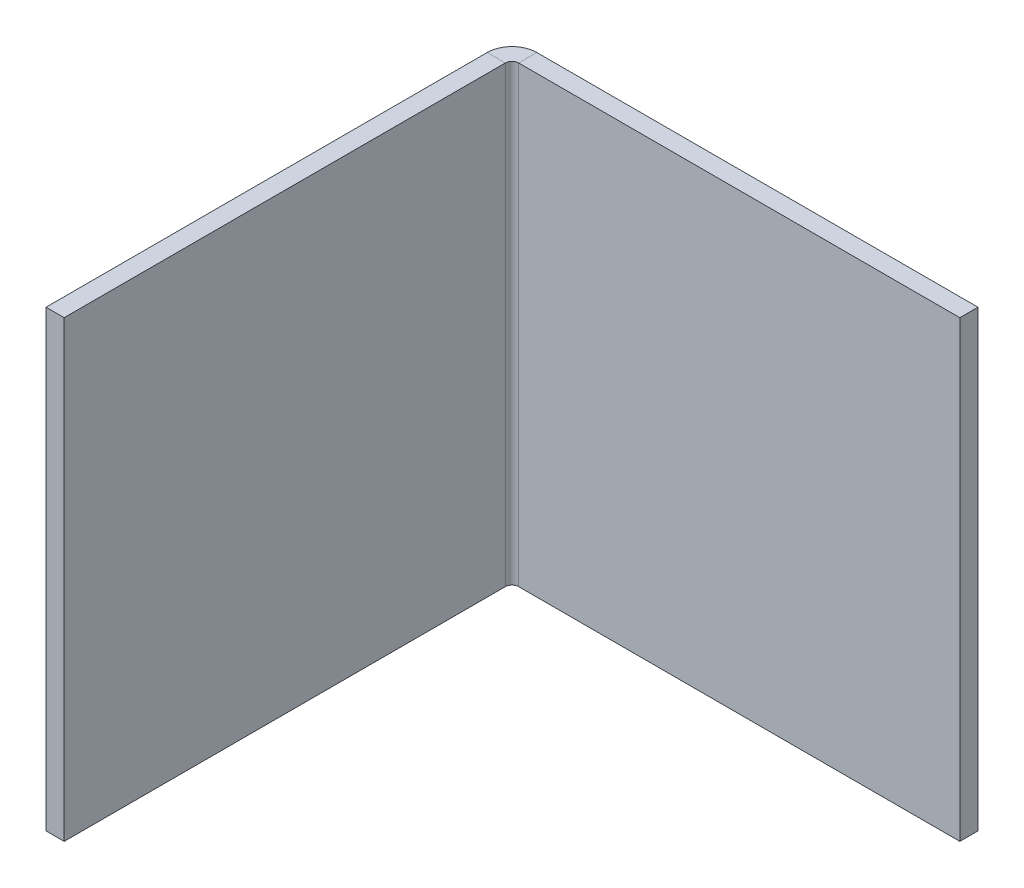
ISO-10303-21;
HEADER;
FILE_DESCRIPTION(('STEP AP214'),'2;1');
FILE_NAME('part.step','',(''),(''),'','','');
FILE_SCHEMA(('AUTOMOTIVE_DESIGN { 1 0 10303 214 1 1 1 1 }'));
ENDSEC;
DATA;
#1=APPLICATION_CONTEXT('core data for automotive mechanical design processes');
#2=APPLICATION_PROTOCOL_DEFINITION('international standard','automotive_design',2000,#1);
#3=PRODUCT_CONTEXT('',#1,'mechanical');
#4=PRODUCT('Part','Part','',(#3));
#5=PRODUCT_RELATED_PRODUCT_CATEGORY('part','',(#4));
#6=PRODUCT_DEFINITION_FORMATION('','',#4);
#7=PRODUCT_DEFINITION_CONTEXT('part definition',#1,'design');
#8=PRODUCT_DEFINITION('design','',#6,#7);
#9=PRODUCT_DEFINITION_SHAPE('','',#8);
#10=(LENGTH_UNIT() NAMED_UNIT(*) SI_UNIT(.MILLI.,.METRE.));
#11=(NAMED_UNIT(*) PLANE_ANGLE_UNIT() SI_UNIT($,.RADIAN.));
#12=(NAMED_UNIT(*) SI_UNIT($,.STERADIAN.) SOLID_ANGLE_UNIT());
#13=UNCERTAINTY_MEASURE_WITH_UNIT(LENGTH_MEASURE(1.E-05),#10,'distance_accuracy_value','');
#14=(GEOMETRIC_REPRESENTATION_CONTEXT(3) GLOBAL_UNCERTAINTY_ASSIGNED_CONTEXT((#13)) GLOBAL_UNIT_ASSIGNED_CONTEXT((#10,
#11,#12)) REPRESENTATION_CONTEXT('',''));
#15=CARTESIAN_POINT('',(0.,0.,0.));
#16=DIRECTION('',(0.,0.,1.));
#17=DIRECTION('',(1.,0.,0.));
#18=AXIS2_PLACEMENT_3D('',#15,#16,#17);
#19=CARTESIAN_POINT('',(-1.37267754944382,-25.,49.372677549444));
#20=DIRECTION('',(0.,-1.,0.));
#21=DIRECTION('',(-1.,0.,0.));
#22=AXIS2_PLACEMENT_3D('',#19,#20,#21);
#23=PLANE('',#22);
#24=DIRECTION('',(0.,0.,-1.));
#25=VECTOR('',#24,1.);
#26=CARTESIAN_POINT('',(-1.37267754944382,-25.,49.372677549444));
#27=LINE('',#26,#25);
#28=CARTESIAN_POINT('',(-1.37267754944382,-25.,49.372677549444));
#29=VERTEX_POINT('',#28);
#30=CARTESIAN_POINT('',(-1.37267754944399,-25.,0.736600000000009));
#31=VERTEX_POINT('',#30);
#32=EDGE_CURVE('E104',#29,#31,#27,.T.);
#33=ORIENTED_EDGE('',*,*,#32,.T.);
#34=DIRECTION('',(1.,0.,0.));
#35=VECTOR('',#34,1.);
#36=CARTESIAN_POINT('',(-1.37267754944399,-25.,0.736600000000009));
#37=LINE('',#36,#35);
#38=CARTESIAN_POINT('',(0.627322450556012,-25.,0.736600000000003));
#39=VERTEX_POINT('',#38);
#40=EDGE_CURVE('E12',#31,#39,#37,.T.);
#41=ORIENTED_EDGE('',*,*,#40,.T.);
#42=DIRECTION('',(0.,0.,-1.));
#43=VECTOR('',#42,1.);
#44=CARTESIAN_POINT('',(0.627322450556181,-25.,49.372677549444));
#45=LINE('',#44,#43);
#46=CARTESIAN_POINT('',(0.627322450556181,-25.,49.372677549444));
#47=VERTEX_POINT('',#46);
#48=EDGE_CURVE('E97',#47,#39,#45,.T.);
#49=ORIENTED_EDGE('',*,*,#48,.F.);
#50=DIRECTION('',(1.,0.,0.));
#51=VECTOR('',#50,1.);
#52=CARTESIAN_POINT('',(-1.37267754944382,-25.,49.372677549444));
#53=LINE('',#52,#51);
#54=EDGE_CURVE('E70',#29,#47,#53,.T.);
#55=ORIENTED_EDGE('',*,*,#54,.F.);
#56=EDGE_LOOP('',(#33,#41,#49,#55));
#57=FACE_BOUND('',#56,.T.);
#58=ADVANCED_FACE('F45',(#57),#23,.T.);
#59=CARTESIAN_POINT('',(-1.37267754944382,25.,49.372677549444));
#60=DIRECTION('',(0.,1.,0.));
#61=DIRECTION('',(1.,0.,0.));
#62=AXIS2_PLACEMENT_3D('',#59,#60,#61);
#63=PLANE('',#62);
#64=DIRECTION('',(0.,0.,1.));
#65=VECTOR('',#64,1.);
#66=CARTESIAN_POINT('',(0.627322450556181,25.,49.372677549444));
#67=LINE('',#66,#65);
#68=CARTESIAN_POINT('',(0.627322450556012,25.,0.736600000000003));
#69=VERTEX_POINT('',#68);
#70=CARTESIAN_POINT('',(0.627322450556181,25.,49.372677549444));
#71=VERTEX_POINT('',#70);
#72=EDGE_CURVE('E99',#69,#71,#67,.T.);
#73=ORIENTED_EDGE('',*,*,#72,.F.);
#74=DIRECTION('',(-1.,0.,0.));
#75=VECTOR('',#74,1.);
#76=CARTESIAN_POINT('',(-1.37267754944399,25.,0.736600000000009));
#77=LINE('',#76,#75);
#78=CARTESIAN_POINT('',(-1.37267754944399,25.,0.736600000000013));
#79=VERTEX_POINT('',#78);
#80=EDGE_CURVE('E153',#69,#79,#77,.T.);
#81=ORIENTED_EDGE('',*,*,#80,.T.);
#82=DIRECTION('',(0.,0.,1.));
#83=VECTOR('',#82,1.);
#84=CARTESIAN_POINT('',(-1.37267754944382,25.,49.372677549444));
#85=LINE('',#84,#83);
#86=CARTESIAN_POINT('',(-1.37267754944382,25.,49.372677549444));
#87=VERTEX_POINT('',#86);
#88=EDGE_CURVE('E48',#79,#87,#85,.T.);
#89=ORIENTED_EDGE('',*,*,#88,.T.);
#90=DIRECTION('',(1.,0.,0.));
#91=VECTOR('',#90,1.);
#92=CARTESIAN_POINT('',(-1.37267754944382,25.,49.372677549444));
#93=LINE('',#92,#91);
#94=EDGE_CURVE('E90',#87,#71,#93,.T.);
#95=ORIENTED_EDGE('',*,*,#94,.T.);
#96=EDGE_LOOP('',(#73,#81,#89,#95));
#97=FACE_BOUND('',#96,.T.);
#98=ADVANCED_FACE('F215',(#97),#63,.T.);
#99=CARTESIAN_POINT('',(-1.37267754944399,0.,-0.627322450556004));
#100=DIRECTION('',(-1.,0.,0.));
#101=DIRECTION('',(0.,0.,1.));
#102=AXIS2_PLACEMENT_3D('',#99,#100,#101);
#103=PLANE('',#102);
#104=ORIENTED_EDGE('',*,*,#88,.F.);
#105=DIRECTION('',(0.,-1.,0.));
#106=VECTOR('',#105,1.);
#107=CARTESIAN_POINT('',(-1.37267754944399,0.,0.736600000000008));
#108=LINE('',#107,#106);
#109=EDGE_CURVE('E89',#79,#31,#108,.T.);
#110=ORIENTED_EDGE('',*,*,#109,.T.);
#111=ORIENTED_EDGE('',*,*,#32,.F.);
#112=DIRECTION('',(0.,-1.,0.));
#113=VECTOR('',#112,1.);
#114=CARTESIAN_POINT('',(-1.37267754944382,-25.,49.372677549444));
#115=LINE('',#114,#113);
#116=EDGE_CURVE('E87',#87,#29,#115,.T.);
#117=ORIENTED_EDGE('',*,*,#116,.F.);
#118=EDGE_LOOP('',(#104,#110,#111,#117));
#119=FACE_BOUND('',#118,.T.);
#120=ADVANCED_FACE('F213',(#119),#103,.T.);
#121=CARTESIAN_POINT('',(-1.37267754944382,-25.,49.372677549444));
#122=DIRECTION('',(0.,0.,1.));
#123=DIRECTION('',(1.,0.,0.));
#124=AXIS2_PLACEMENT_3D('',#121,#122,#123);
#125=PLANE('',#124);
#126=DIRECTION('',(0.,-1.,0.));
#127=VECTOR('',#126,1.);
#128=CARTESIAN_POINT('',(0.627322450556181,-25.,49.372677549444));
#129=LINE('',#128,#127);
#130=EDGE_CURVE('E85',#71,#47,#129,.T.);
#131=ORIENTED_EDGE('',*,*,#130,.F.);
#132=ORIENTED_EDGE('',*,*,#94,.F.);
#133=ORIENTED_EDGE('',*,*,#116,.T.);
#134=ORIENTED_EDGE('',*,*,#54,.T.);
#135=EDGE_LOOP('',(#131,#132,#133,#134));
#136=FACE_BOUND('',#135,.T.);
#137=ADVANCED_FACE('F83',(#136),#125,.T.);
#138=CARTESIAN_POINT('',(0.627322450556007,0.,-0.627322450556011));
#139=DIRECTION('',(-1.,0.,0.));
#140=DIRECTION('',(0.,0.,1.));
#141=AXIS2_PLACEMENT_3D('',#138,#139,#140);
#142=PLANE('',#141);
#143=DIRECTION('',(0.,-1.,0.));
#144=VECTOR('',#143,1.);
#145=CARTESIAN_POINT('',(0.627322450556011,0.,0.736600000000001));
#146=LINE('',#145,#144);
#147=EDGE_CURVE('E53',#69,#39,#146,.T.);
#148=ORIENTED_EDGE('',*,*,#147,.F.);
#149=ORIENTED_EDGE('',*,*,#72,.T.);
#150=ORIENTED_EDGE('',*,*,#130,.T.);
#151=ORIENTED_EDGE('',*,*,#48,.T.);
#152=EDGE_LOOP('',(#148,#149,#150,#151));
#153=FACE_BOUND('',#152,.T.);
#154=ADVANCED_FACE('F95',(#153),#142,.F.);
#155=CARTESIAN_POINT('',(50.,-25.,-2.));
#156=DIRECTION('',(1.,0.,0.));
#157=DIRECTION('',(0.,0.,-1.));
#158=AXIS2_PLACEMENT_3D('',#155,#156,#157);
#159=PLANE('',#158);
#160=DIRECTION('',(0.,1.,0.));
#161=VECTOR('',#160,1.);
#162=CARTESIAN_POINT('',(50.,-25.,0.));
#163=LINE('',#162,#161);
#164=CARTESIAN_POINT('',(50.,-25.,0.));
#165=VERTEX_POINT('',#164);
#166=CARTESIAN_POINT('',(50.,25.,0.));
#167=VERTEX_POINT('',#166);
#168=EDGE_CURVE('E115',#165,#167,#163,.T.);
#169=ORIENTED_EDGE('',*,*,#168,.F.);
#170=DIRECTION('',(0.,0.,1.));
#171=VECTOR('',#170,1.);
#172=CARTESIAN_POINT('',(50.,-25.,-2.));
#173=LINE('',#172,#171);
#174=CARTESIAN_POINT('',(50.,-25.,-2.));
#175=VERTEX_POINT('',#174);
#176=EDGE_CURVE('E105',#175,#165,#173,.T.);
#177=ORIENTED_EDGE('',*,*,#176,.F.);
#178=DIRECTION('',(0.,1.,0.));
#179=VECTOR('',#178,1.);
#180=CARTESIAN_POINT('',(50.,-25.,-2.));
#181=LINE('',#180,#179);
#182=CARTESIAN_POINT('',(50.,25.,-2.));
#183=VERTEX_POINT('',#182);
#184=EDGE_CURVE('E138',#175,#183,#181,.T.);
#185=ORIENTED_EDGE('',*,*,#184,.T.);
#186=DIRECTION('',(0.,0.,1.));
#187=VECTOR('',#186,1.);
#188=CARTESIAN_POINT('',(50.,25.,-2.));
#189=LINE('',#188,#187);
#190=EDGE_CURVE('E135',#183,#167,#189,.T.);
#191=ORIENTED_EDGE('',*,*,#190,.T.);
#192=EDGE_LOOP('',(#169,#177,#185,#191));
#193=FACE_BOUND('',#192,.T.);
#194=ADVANCED_FACE('F207',(#193),#159,.T.);
#195=CARTESIAN_POINT('',(0.,0.,-2.));
#196=DIRECTION('',(0.,0.,-1.));
#197=DIRECTION('',(-1.,0.,0.));
#198=AXIS2_PLACEMENT_3D('',#195,#196,#197);
#199=PLANE('',#198);
#200=DIRECTION('',(0.,-1.,0.));
#201=VECTOR('',#200,1.);
#202=CARTESIAN_POINT('',(1.36392245055601,0.,-2.));
#203=LINE('',#202,#201);
#204=CARTESIAN_POINT('',(1.36392245055601,25.,-2.));
#205=VERTEX_POINT('',#204);
#206=CARTESIAN_POINT('',(1.36392245055601,-25.,-2.));
#207=VERTEX_POINT('',#206);
#208=EDGE_CURVE('E147',#205,#207,#203,.T.);
#209=ORIENTED_EDGE('',*,*,#208,.F.);
#210=DIRECTION('',(-1.,0.,0.));
#211=VECTOR('',#210,1.);
#212=CARTESIAN_POINT('',(-50.,25.,-2.));
#213=LINE('',#212,#211);
#214=EDGE_CURVE('E132',#183,#205,#213,.T.);
#215=ORIENTED_EDGE('',*,*,#214,.F.);
#216=ORIENTED_EDGE('',*,*,#184,.F.);
#217=DIRECTION('',(1.,0.,0.));
#218=VECTOR('',#217,1.);
#219=CARTESIAN_POINT('',(-50.,-25.,-2.));
#220=LINE('',#219,#218);
#221=EDGE_CURVE('E107',#207,#175,#220,.T.);
#222=ORIENTED_EDGE('',*,*,#221,.F.);
#223=EDGE_LOOP('',(#209,#215,#216,#222));
#224=FACE_BOUND('',#223,.T.);
#225=ADVANCED_FACE('F206',(#224),#199,.T.);
#226=CARTESIAN_POINT('',(-50.,25.,-2.));
#227=DIRECTION('',(0.,1.,0.));
#228=DIRECTION('',(0.,0.,1.));
#229=AXIS2_PLACEMENT_3D('',#226,#227,#228);
#230=PLANE('',#229);
#231=DIRECTION('',(0.,0.,-1.));
#232=VECTOR('',#231,1.);
#233=CARTESIAN_POINT('',(1.36392245055601,25.,-2.));
#234=LINE('',#233,#232);
#235=CARTESIAN_POINT('',(1.36392245055601,25.,0.));
#236=VERTEX_POINT('',#235);
#237=EDGE_CURVE('E141',#236,#205,#234,.T.);
#238=ORIENTED_EDGE('',*,*,#237,.F.);
#239=DIRECTION('',(-1.,0.,0.));
#240=VECTOR('',#239,1.);
#241=CARTESIAN_POINT('',(-50.,25.,0.));
#242=LINE('',#241,#240);
#243=EDGE_CURVE('E129',#167,#236,#242,.T.);
#244=ORIENTED_EDGE('',*,*,#243,.F.);
#245=ORIENTED_EDGE('',*,*,#190,.F.);
#246=ORIENTED_EDGE('',*,*,#214,.T.);
#247=EDGE_LOOP('',(#238,#244,#245,#246));
#248=FACE_BOUND('',#247,.T.);
#249=ADVANCED_FACE('F204',(#248),#230,.T.);
#250=CARTESIAN_POINT('',(0.,0.,0.));
#251=DIRECTION('',(0.,0.,-1.));
#252=DIRECTION('',(-1.,0.,0.));
#253=AXIS2_PLACEMENT_3D('',#250,#251,#252);
#254=PLANE('',#253);
#255=ORIENTED_EDGE('',*,*,#243,.T.);
#256=DIRECTION('',(0.,-1.,0.));
#257=VECTOR('',#256,1.);
#258=CARTESIAN_POINT('',(1.36392245055601,0.,0.));
#259=LINE('',#258,#257);
#260=CARTESIAN_POINT('',(1.36392245055601,-25.,0.));
#261=VERTEX_POINT('',#260);
#262=EDGE_CURVE('E126',#236,#261,#259,.T.);
#263=ORIENTED_EDGE('',*,*,#262,.T.);
#264=DIRECTION('',(1.,0.,0.));
#265=VECTOR('',#264,1.);
#266=CARTESIAN_POINT('',(-50.,-25.,0.));
#267=LINE('',#266,#265);
#268=EDGE_CURVE('E123',#261,#165,#267,.T.);
#269=ORIENTED_EDGE('',*,*,#268,.T.);
#270=ORIENTED_EDGE('',*,*,#168,.T.);
#271=EDGE_LOOP('',(#255,#263,#269,#270));
#272=FACE_BOUND('',#271,.T.);
#273=ADVANCED_FACE('F208',(#272),#254,.F.);
#274=CARTESIAN_POINT('',(-50.,-25.,-2.));
#275=DIRECTION('',(0.,-1.,0.));
#276=DIRECTION('',(0.,0.,-1.));
#277=AXIS2_PLACEMENT_3D('',#274,#275,#276);
#278=PLANE('',#277);
#279=DIRECTION('',(0.,0.,1.));
#280=VECTOR('',#279,1.);
#281=CARTESIAN_POINT('',(1.36392245055601,-25.,-2.));
#282=LINE('',#281,#280);
#283=EDGE_CURVE('E144',#207,#261,#282,.T.);
#284=ORIENTED_EDGE('',*,*,#283,.F.);
#285=ORIENTED_EDGE('',*,*,#221,.T.);
#286=ORIENTED_EDGE('',*,*,#176,.T.);
#287=ORIENTED_EDGE('',*,*,#268,.F.);
#288=EDGE_LOOP('',(#284,#285,#286,#287));
#289=FACE_BOUND('',#288,.T.);
#290=ADVANCED_FACE('F209',(#289),#278,.T.);
#291=CARTESIAN_POINT('',(1.36392245055601,25.,0.7366));
#292=DIRECTION('',(0.,1.,0.));
#293=DIRECTION('',(0.,0.,1.));
#294=AXIS2_PLACEMENT_3D('',#291,#292,#293);
#295=PLANE('',#294);
#296=ORIENTED_EDGE('',*,*,#80,.F.);
#297=CARTESIAN_POINT('',(1.36392245055601,25.,0.7366));
#298=DIRECTION('',(0.,1.,0.));
#299=DIRECTION('',(0.,0.,1.));
#300=AXIS2_PLACEMENT_3D('',#297,#298,#299);
#301=CIRCLE('',#300,0.7366);
#302=EDGE_CURVE('E166',#69,#236,#301,.F.);
#303=ORIENTED_EDGE('',*,*,#302,.T.);
#304=ORIENTED_EDGE('',*,*,#237,.T.);
#305=CARTESIAN_POINT('',(1.36392245055601,25.,0.7366));
#306=DIRECTION('',(0.,-1.,0.));
#307=DIRECTION('',(0.,0.,1.));
#308=AXIS2_PLACEMENT_3D('',#305,#306,#307);
#309=CIRCLE('',#308,2.7366);
#310=EDGE_CURVE('E171',#79,#205,#309,.T.);
#311=ORIENTED_EDGE('',*,*,#310,.F.);
#312=EDGE_LOOP('',(#296,#303,#304,#311));
#313=FACE_BOUND('',#312,.T.);
#314=ADVANCED_FACE('F178',(#313),#295,.T.);
#315=CARTESIAN_POINT('',(1.36392245055601,-25.,0.7366));
#316=DIRECTION('',(0.,-1.,0.));
#317=DIRECTION('',(0.,0.,-1.));
#318=AXIS2_PLACEMENT_3D('',#315,#316,#317);
#319=PLANE('',#318);
#320=CARTESIAN_POINT('',(1.36392245055601,-25.,0.7366));
#321=DIRECTION('',(0.,1.,0.));
#322=DIRECTION('',(0.,0.,1.));
#323=AXIS2_PLACEMENT_3D('',#320,#321,#322);
#324=CIRCLE('',#323,0.7366);
#325=EDGE_CURVE('E118',#261,#39,#324,.T.);
#326=ORIENTED_EDGE('',*,*,#325,.T.);
#327=ORIENTED_EDGE('',*,*,#40,.F.);
#328=CARTESIAN_POINT('',(1.36392245055601,-25.,0.7366));
#329=DIRECTION('',(0.,1.,0.));
#330=DIRECTION('',(0.,0.,-1.));
#331=AXIS2_PLACEMENT_3D('',#328,#329,#330);
#332=CIRCLE('',#331,2.7366);
#333=EDGE_CURVE('E61',#207,#31,#332,.T.);
#334=ORIENTED_EDGE('',*,*,#333,.F.);
#335=ORIENTED_EDGE('',*,*,#283,.T.);
#336=EDGE_LOOP('',(#326,#327,#334,#335));
#337=FACE_BOUND('',#336,.T.);
#338=ADVANCED_FACE('F169',(#337),#319,.T.);
#339=CARTESIAN_POINT('',(1.36392245055601,-50.1142807770851,0.7366));
#340=DIRECTION('',(0.,1.,0.));
#341=DIRECTION('',(0.,0.,1.));
#342=AXIS2_PLACEMENT_3D('',#339,#340,#341);
#343=CYLINDRICAL_SURFACE('',#342,2.7366);
#344=ORIENTED_EDGE('',*,*,#208,.T.);
#345=ORIENTED_EDGE('',*,*,#333,.T.);
#346=ORIENTED_EDGE('',*,*,#109,.F.);
#347=ORIENTED_EDGE('',*,*,#310,.T.);
#348=EDGE_LOOP('',(#344,#345,#346,#347));
#349=FACE_BOUND('',#348,.T.);
#350=ADVANCED_FACE('F210',(#349),#343,.T.);
#351=CARTESIAN_POINT('',(1.36392245055601,-50.1142807770851,0.7366));
#352=DIRECTION('',(0.,1.,0.));
#353=DIRECTION('',(0.,0.,1.));
#354=AXIS2_PLACEMENT_3D('',#351,#352,#353);
#355=CYLINDRICAL_SURFACE('',#354,0.7366);
#356=ORIENTED_EDGE('',*,*,#262,.F.);
#357=ORIENTED_EDGE('',*,*,#302,.F.);
#358=ORIENTED_EDGE('',*,*,#147,.T.);
#359=ORIENTED_EDGE('',*,*,#325,.F.);
#360=EDGE_LOOP('',(#356,#357,#358,#359));
#361=FACE_BOUND('',#360,.T.);
#362=ADVANCED_FACE('F162',(#361),#355,.F.);
#363=CLOSED_SHELL('',(#58,#98,#120,#137,#154,#194,#225,#249,#273,#290,#314,#338,#350,#362));
#364=MANIFOLD_SOLID_BREP('B2',#363);
#365=ADVANCED_BREP_SHAPE_REPRESENTATION('',(#18,#364),#14);
#366=SHAPE_DEFINITION_REPRESENTATION(#9,#365);
ENDSEC;
END-ISO-10303-21;
